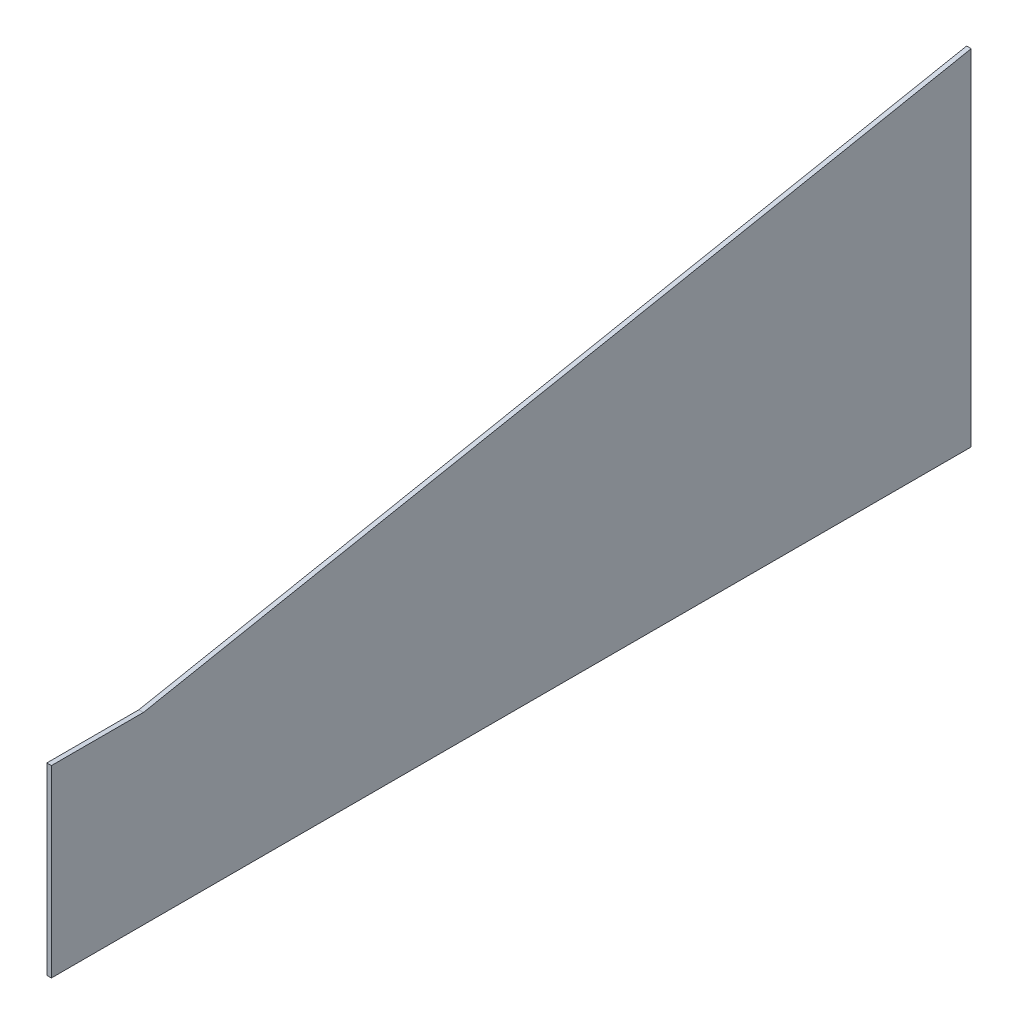
ISO-10303-21;
HEADER;
FILE_DESCRIPTION(('STEP AP214'),'2;1');
FILE_NAME('part.step','',(''),(''),'','','');
FILE_SCHEMA(('AUTOMOTIVE_DESIGN { 1 0 10303 214 1 1 1 1 }'));
ENDSEC;
DATA;
#1=APPLICATION_CONTEXT('core data for automotive mechanical design processes');
#2=APPLICATION_PROTOCOL_DEFINITION('international standard','automotive_design',2000,#1);
#3=PRODUCT_CONTEXT('',#1,'mechanical');
#4=PRODUCT('Part','Part','',(#3));
#5=PRODUCT_RELATED_PRODUCT_CATEGORY('part','',(#4));
#6=PRODUCT_DEFINITION_FORMATION('','',#4);
#7=PRODUCT_DEFINITION_CONTEXT('part definition',#1,'design');
#8=PRODUCT_DEFINITION('design','',#6,#7);
#9=PRODUCT_DEFINITION_SHAPE('','',#8);
#10=(LENGTH_UNIT() NAMED_UNIT(*) SI_UNIT(.MILLI.,.METRE.));
#11=(NAMED_UNIT(*) PLANE_ANGLE_UNIT() SI_UNIT($,.RADIAN.));
#12=(NAMED_UNIT(*) SI_UNIT($,.STERADIAN.) SOLID_ANGLE_UNIT());
#13=UNCERTAINTY_MEASURE_WITH_UNIT(LENGTH_MEASURE(1.E-05),#10,'distance_accuracy_value','');
#14=(GEOMETRIC_REPRESENTATION_CONTEXT(3) GLOBAL_UNCERTAINTY_ASSIGNED_CONTEXT((#13)) GLOBAL_UNIT_ASSIGNED_CONTEXT((#10,
#11,#12)) REPRESENTATION_CONTEXT('',''));
#15=CARTESIAN_POINT('',(0.,0.,0.));
#16=DIRECTION('',(0.,0.,1.));
#17=DIRECTION('',(1.,0.,0.));
#18=AXIS2_PLACEMENT_3D('',#15,#16,#17);
#19=CARTESIAN_POINT('',(10.,438.959107806692,85.3531598513011));
#20=DIRECTION('',(0.,0.981615389668581,0.190869659102224));
#21=DIRECTION('',(0.,-0.190869659102224,0.981615389668581));
#22=AXIS2_PLACEMENT_3D('',#19,#20,#21);
#23=PLANE('',#22);
#24=DIRECTION('',(0.,0.190869659102224,-0.981615389668581));
#25=VECTOR('',#24,1.);
#26=CARTESIAN_POINT('',(0.,438.959107806692,85.3531598513011));
#27=LINE('',#26,#25);
#28=CARTESIAN_POINT('',(0.,300.,800.));
#29=VERTEX_POINT('',#28);
#30=CARTESIAN_POINT('',(0.,650.,-1000.));
#31=VERTEX_POINT('',#30);
#32=EDGE_CURVE('E112',#29,#31,#27,.T.);
#33=ORIENTED_EDGE('',*,*,#32,.F.);
#34=DIRECTION('',(-1.,0.,0.));
#35=VECTOR('',#34,1.);
#36=CARTESIAN_POINT('',(10.,300.,800.));
#37=LINE('',#36,#35);
#38=CARTESIAN_POINT('',(10.,300.,800.));
#39=VERTEX_POINT('',#38);
#40=EDGE_CURVE('E11',#39,#29,#37,.T.);
#41=ORIENTED_EDGE('',*,*,#40,.F.);
#42=DIRECTION('',(0.,0.190869659102224,-0.981615389668581));
#43=VECTOR('',#42,1.);
#44=CARTESIAN_POINT('',(10.,438.959107806692,85.3531598513011));
#45=LINE('',#44,#43);
#46=CARTESIAN_POINT('',(10.,650.,-1000.));
#47=VERTEX_POINT('',#46);
#48=EDGE_CURVE('E107',#39,#47,#45,.T.);
#49=ORIENTED_EDGE('',*,*,#48,.T.);
#50=DIRECTION('',(-1.,0.,0.));
#51=VECTOR('',#50,1.);
#52=CARTESIAN_POINT('',(10.,650.,-1000.));
#53=LINE('',#52,#51);
#54=EDGE_CURVE('E53',#47,#31,#53,.T.);
#55=ORIENTED_EDGE('',*,*,#54,.T.);
#56=EDGE_LOOP('',(#33,#41,#49,#55));
#57=FACE_BOUND('',#56,.T.);
#58=ADVANCED_FACE('F37',(#57),#23,.T.);
#59=CARTESIAN_POINT('',(10.,300.,0.));
#60=DIRECTION('',(0.,-1.,0.));
#61=DIRECTION('',(0.,0.,-1.));
#62=AXIS2_PLACEMENT_3D('',#59,#60,#61);
#63=PLANE('',#62);
#64=DIRECTION('',(0.,0.,1.));
#65=VECTOR('',#64,1.);
#66=CARTESIAN_POINT('',(0.,300.,0.));
#67=LINE('',#66,#65);
#68=CARTESIAN_POINT('',(0.,300.,1000.));
#69=VERTEX_POINT('',#68);
#70=EDGE_CURVE('E114',#29,#69,#67,.T.);
#71=ORIENTED_EDGE('',*,*,#70,.T.);
#72=DIRECTION('',(-1.,0.,0.));
#73=VECTOR('',#72,1.);
#74=CARTESIAN_POINT('',(10.,300.,1000.));
#75=LINE('',#74,#73);
#76=CARTESIAN_POINT('',(10.,300.,1000.));
#77=VERTEX_POINT('',#76);
#78=EDGE_CURVE('E45',#77,#69,#75,.T.);
#79=ORIENTED_EDGE('',*,*,#78,.F.);
#80=DIRECTION('',(0.,0.,1.));
#81=VECTOR('',#80,1.);
#82=CARTESIAN_POINT('',(10.,300.,0.));
#83=LINE('',#82,#81);
#84=EDGE_CURVE('E104',#39,#77,#83,.T.);
#85=ORIENTED_EDGE('',*,*,#84,.F.);
#86=ORIENTED_EDGE('',*,*,#40,.T.);
#87=EDGE_LOOP('',(#71,#79,#85,#86));
#88=FACE_BOUND('',#87,.T.);
#89=ADVANCED_FACE('F126',(#88),#63,.F.);
#90=CARTESIAN_POINT('',(10.,0.,1000.));
#91=DIRECTION('',(0.,0.,1.));
#92=DIRECTION('',(1.,0.,0.));
#93=AXIS2_PLACEMENT_3D('',#90,#91,#92);
#94=PLANE('',#93);
#95=DIRECTION('',(0.,1.,0.));
#96=VECTOR('',#95,1.);
#97=CARTESIAN_POINT('',(0.,0.,1000.));
#98=LINE('',#97,#96);
#99=CARTESIAN_POINT('',(0.,-100.,1000.));
#100=VERTEX_POINT('',#99);
#101=EDGE_CURVE('E92',#100,#69,#98,.T.);
#102=ORIENTED_EDGE('',*,*,#101,.F.);
#103=DIRECTION('',(-1.,0.,0.));
#104=VECTOR('',#103,1.);
#105=CARTESIAN_POINT('',(10.,-100.,1000.));
#106=LINE('',#105,#104);
#107=CARTESIAN_POINT('',(10.,-100.,1000.));
#108=VERTEX_POINT('',#107);
#109=EDGE_CURVE('E86',#108,#100,#106,.T.);
#110=ORIENTED_EDGE('',*,*,#109,.F.);
#111=DIRECTION('',(0.,1.,0.));
#112=VECTOR('',#111,1.);
#113=CARTESIAN_POINT('',(10.,0.,1000.));
#114=LINE('',#113,#112);
#115=EDGE_CURVE('E90',#108,#77,#114,.T.);
#116=ORIENTED_EDGE('',*,*,#115,.T.);
#117=ORIENTED_EDGE('',*,*,#78,.T.);
#118=EDGE_LOOP('',(#102,#110,#116,#117));
#119=FACE_BOUND('',#118,.T.);
#120=ADVANCED_FACE('F88',(#119),#94,.T.);
#121=CARTESIAN_POINT('',(10.,-100.,0.));
#122=DIRECTION('',(0.,1.,0.));
#123=DIRECTION('',(0.,0.,1.));
#124=AXIS2_PLACEMENT_3D('',#121,#122,#123);
#125=PLANE('',#124);
#126=DIRECTION('',(0.,0.,-1.));
#127=VECTOR('',#126,1.);
#128=CARTESIAN_POINT('',(0.,-100.,0.));
#129=LINE('',#128,#127);
#130=CARTESIAN_POINT('',(0.,-100.,-1000.));
#131=VERTEX_POINT('',#130);
#132=EDGE_CURVE('E118',#100,#131,#129,.T.);
#133=ORIENTED_EDGE('',*,*,#132,.T.);
#134=DIRECTION('',(-1.,0.,0.));
#135=VECTOR('',#134,1.);
#136=CARTESIAN_POINT('',(10.,-100.,-1000.));
#137=LINE('',#136,#135);
#138=CARTESIAN_POINT('',(10.,-100.,-1000.));
#139=VERTEX_POINT('',#138);
#140=EDGE_CURVE('E70',#139,#131,#137,.T.);
#141=ORIENTED_EDGE('',*,*,#140,.F.);
#142=DIRECTION('',(0.,0.,-1.));
#143=VECTOR('',#142,1.);
#144=CARTESIAN_POINT('',(10.,-100.,0.));
#145=LINE('',#144,#143);
#146=EDGE_CURVE('E96',#108,#139,#145,.T.);
#147=ORIENTED_EDGE('',*,*,#146,.F.);
#148=ORIENTED_EDGE('',*,*,#109,.T.);
#149=EDGE_LOOP('',(#133,#141,#147,#148));
#150=FACE_BOUND('',#149,.T.);
#151=ADVANCED_FACE('F97',(#150),#125,.F.);
#152=CARTESIAN_POINT('',(10.,0.,-1000.));
#153=DIRECTION('',(0.,0.,-1.));
#154=DIRECTION('',(-1.,0.,0.));
#155=AXIS2_PLACEMENT_3D('',#152,#153,#154);
#156=PLANE('',#155);
#157=DIRECTION('',(0.,-1.,0.));
#158=VECTOR('',#157,1.);
#159=CARTESIAN_POINT('',(0.,0.,-1000.));
#160=LINE('',#159,#158);
#161=EDGE_CURVE('E120',#31,#131,#160,.T.);
#162=ORIENTED_EDGE('',*,*,#161,.F.);
#163=ORIENTED_EDGE('',*,*,#54,.F.);
#164=DIRECTION('',(0.,-1.,0.));
#165=VECTOR('',#164,1.);
#166=CARTESIAN_POINT('',(10.,0.,-1000.));
#167=LINE('',#166,#165);
#168=EDGE_CURVE('E100',#47,#139,#167,.T.);
#169=ORIENTED_EDGE('',*,*,#168,.T.);
#170=ORIENTED_EDGE('',*,*,#140,.T.);
#171=EDGE_LOOP('',(#162,#163,#169,#170));
#172=FACE_BOUND('',#171,.T.);
#173=ADVANCED_FACE('F129',(#172),#156,.T.);
#174=CARTESIAN_POINT('',(10.,0.,0.));
#175=DIRECTION('',(1.,0.,0.));
#176=DIRECTION('',(0.,0.,-1.));
#177=AXIS2_PLACEMENT_3D('',#174,#175,#176);
#178=PLANE('',#177);
#179=ORIENTED_EDGE('',*,*,#48,.F.);
#180=ORIENTED_EDGE('',*,*,#84,.T.);
#181=ORIENTED_EDGE('',*,*,#115,.F.);
#182=ORIENTED_EDGE('',*,*,#146,.T.);
#183=ORIENTED_EDGE('',*,*,#168,.F.);
#184=EDGE_LOOP('',(#179,#180,#181,#182,#183));
#185=FACE_BOUND('',#184,.T.);
#186=ADVANCED_FACE('F103',(#185),#178,.T.);
#187=CARTESIAN_POINT('',(0.,0.,0.));
#188=DIRECTION('',(1.,0.,0.));
#189=DIRECTION('',(0.,0.,-1.));
#190=AXIS2_PLACEMENT_3D('',#187,#188,#189);
#191=PLANE('',#190);
#192=ORIENTED_EDGE('',*,*,#32,.T.);
#193=ORIENTED_EDGE('',*,*,#161,.T.);
#194=ORIENTED_EDGE('',*,*,#132,.F.);
#195=ORIENTED_EDGE('',*,*,#101,.T.);
#196=ORIENTED_EDGE('',*,*,#70,.F.);
#197=EDGE_LOOP('',(#192,#193,#194,#195,#196));
#198=FACE_BOUND('',#197,.T.);
#199=ADVANCED_FACE('F128',(#198),#191,.F.);
#200=CLOSED_SHELL('',(#58,#89,#120,#151,#173,#186,#199));
#201=MANIFOLD_SOLID_BREP('B2',#200);
#202=ADVANCED_BREP_SHAPE_REPRESENTATION('',(#18,#201),#14);
#203=SHAPE_DEFINITION_REPRESENTATION(#9,#202);
ENDSEC;
END-ISO-10303-21;
